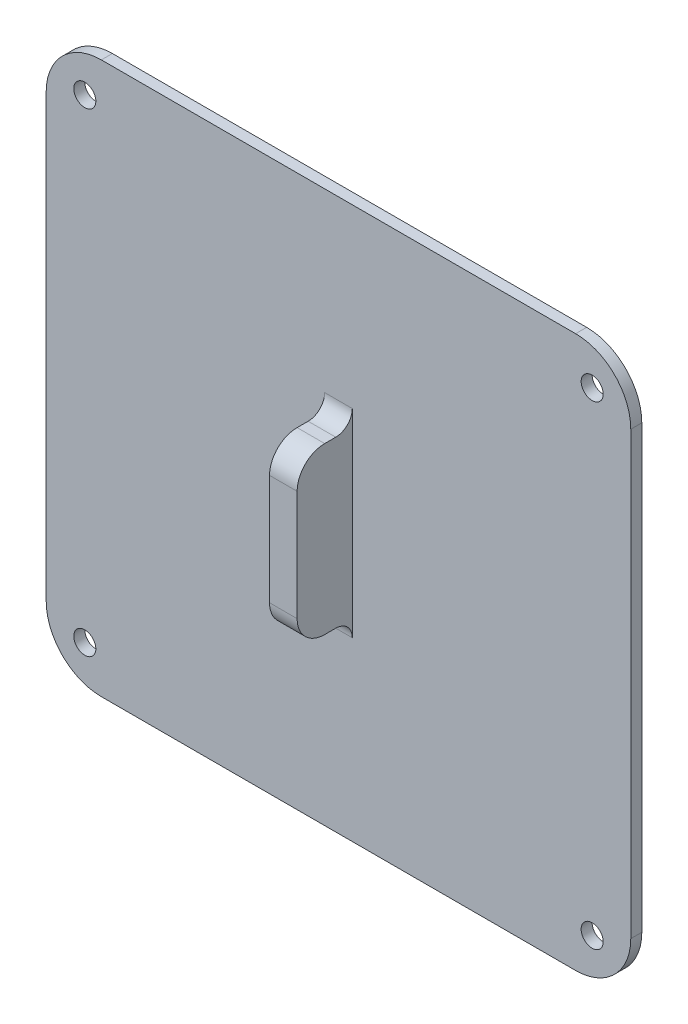
ISO-10303-21;
HEADER;
FILE_DESCRIPTION(('STEP AP214'),'2;1');
FILE_NAME('part.step','',(''),(''),'','','');
FILE_SCHEMA(('AUTOMOTIVE_DESIGN { 1 0 10303 214 1 1 1 1 }'));
ENDSEC;
DATA;
#1=APPLICATION_CONTEXT('core data for automotive mechanical design processes');
#2=APPLICATION_PROTOCOL_DEFINITION('international standard','automotive_design',2000,#1);
#3=PRODUCT_CONTEXT('',#1,'mechanical');
#4=PRODUCT('Part','Part','',(#3));
#5=PRODUCT_RELATED_PRODUCT_CATEGORY('part','',(#4));
#6=PRODUCT_DEFINITION_FORMATION('','',#4);
#7=PRODUCT_DEFINITION_CONTEXT('part definition',#1,'design');
#8=PRODUCT_DEFINITION('design','',#6,#7);
#9=PRODUCT_DEFINITION_SHAPE('','',#8);
#10=(LENGTH_UNIT() NAMED_UNIT(*) SI_UNIT(.MILLI.,.METRE.));
#11=(NAMED_UNIT(*) PLANE_ANGLE_UNIT() SI_UNIT($,.RADIAN.));
#12=(NAMED_UNIT(*) SI_UNIT($,.STERADIAN.) SOLID_ANGLE_UNIT());
#13=UNCERTAINTY_MEASURE_WITH_UNIT(LENGTH_MEASURE(1.E-05),#10,'distance_accuracy_value','');
#14=(GEOMETRIC_REPRESENTATION_CONTEXT(3) GLOBAL_UNCERTAINTY_ASSIGNED_CONTEXT((#13)) GLOBAL_UNIT_ASSIGNED_CONTEXT((#10,
#11,#12)) REPRESENTATION_CONTEXT('',''));
#15=CARTESIAN_POINT('',(0.,0.,0.));
#16=DIRECTION('',(0.,0.,1.));
#17=DIRECTION('',(1.,0.,0.));
#18=AXIS2_PLACEMENT_3D('',#15,#16,#17);
#19=CARTESIAN_POINT('',(-43.0000000000001,270.,0.));
#20=DIRECTION('',(0.,0.,1.));
#21=DIRECTION('',(1.,0.,0.));
#22=AXIS2_PLACEMENT_3D('',#19,#20,#21);
#23=PLANE('',#22);
#24=CARTESIAN_POINT('',(-46.,353.,0.));
#25=DIRECTION('',(0.,0.,1.));
#26=DIRECTION('',(1.,0.,0.));
#27=AXIS2_PLACEMENT_3D('',#24,#25,#26);
#28=CIRCLE('',#27,2.);
#29=CARTESIAN_POINT('',(-44.,353.,0.));
#30=VERTEX_POINT('',#29);
#31=EDGE_CURVE('E196',#30,#30,#28,.T.);
#32=ORIENTED_EDGE('',*,*,#31,.F.);
#33=EDGE_LOOP('',(#32));
#34=FACE_BOUND('',#33,.T.);
#35=CARTESIAN_POINT('',(46.,353.,0.));
#36=DIRECTION('',(0.,0.,1.));
#37=DIRECTION('',(1.,0.,0.));
#38=AXIS2_PLACEMENT_3D('',#35,#36,#37);
#39=CIRCLE('',#38,2.);
#40=CARTESIAN_POINT('',(48.,353.,0.));
#41=VERTEX_POINT('',#40);
#42=EDGE_CURVE('E231',#41,#41,#39,.T.);
#43=ORIENTED_EDGE('',*,*,#42,.F.);
#44=EDGE_LOOP('',(#43));
#45=FACE_BOUND('',#44,.T.);
#46=CARTESIAN_POINT('',(46.,267.,0.));
#47=DIRECTION('',(0.,0.,1.));
#48=DIRECTION('',(1.,0.,0.));
#49=AXIS2_PLACEMENT_3D('',#46,#47,#48);
#50=CIRCLE('',#49,2.);
#51=CARTESIAN_POINT('',(48.,267.,0.));
#52=VERTEX_POINT('',#51);
#53=EDGE_CURVE('E228',#52,#52,#50,.T.);
#54=ORIENTED_EDGE('',*,*,#53,.F.);
#55=EDGE_LOOP('',(#54));
#56=FACE_BOUND('',#55,.T.);
#57=CARTESIAN_POINT('',(-46.,267.,0.));
#58=DIRECTION('',(0.,0.,1.));
#59=DIRECTION('',(1.,0.,0.));
#60=AXIS2_PLACEMENT_3D('',#57,#58,#59);
#61=CIRCLE('',#60,2.);
#62=CARTESIAN_POINT('',(-44.,267.,0.));
#63=VERTEX_POINT('',#62);
#64=EDGE_CURVE('E225',#63,#63,#61,.T.);
#65=ORIENTED_EDGE('',*,*,#64,.F.);
#66=EDGE_LOOP('',(#65));
#67=FACE_BOUND('',#66,.T.);
#68=CARTESIAN_POINT('',(-43.0000000000001,270.,0.));
#69=DIRECTION('',(0.,0.,1.));
#70=DIRECTION('',(1.,0.,0.));
#71=AXIS2_PLACEMENT_3D('',#68,#69,#70);
#72=CIRCLE('',#71,10.);
#73=CARTESIAN_POINT('',(-53.0000000000001,270.,0.));
#74=VERTEX_POINT('',#73);
#75=CARTESIAN_POINT('',(-43.0000000000001,260.,0.));
#76=VERTEX_POINT('',#75);
#77=EDGE_CURVE('E194',#74,#76,#72,.T.);
#78=ORIENTED_EDGE('',*,*,#77,.T.);
#79=DIRECTION('',(1.,0.,0.));
#80=VECTOR('',#79,1.);
#81=CARTESIAN_POINT('',(-43.0000000000001,260.,0.));
#82=LINE('',#81,#80);
#83=CARTESIAN_POINT('',(43.,260.,0.));
#84=VERTEX_POINT('',#83);
#85=EDGE_CURVE('E150',#76,#84,#82,.T.);
#86=ORIENTED_EDGE('',*,*,#85,.T.);
#87=CARTESIAN_POINT('',(43.,270.,0.));
#88=DIRECTION('',(0.,0.,1.));
#89=DIRECTION('',(1.,0.,0.));
#90=AXIS2_PLACEMENT_3D('',#87,#88,#89);
#91=CIRCLE('',#90,10.);
#92=CARTESIAN_POINT('',(53.,270.,0.));
#93=VERTEX_POINT('',#92);
#94=EDGE_CURVE('E198',#84,#93,#91,.T.);
#95=ORIENTED_EDGE('',*,*,#94,.T.);
#96=DIRECTION('',(0.,1.,0.));
#97=VECTOR('',#96,1.);
#98=CARTESIAN_POINT('',(53.,270.,0.));
#99=LINE('',#98,#97);
#100=CARTESIAN_POINT('',(53.,350.,0.));
#101=VERTEX_POINT('',#100);
#102=EDGE_CURVE('E201',#93,#101,#99,.T.);
#103=ORIENTED_EDGE('',*,*,#102,.T.);
#104=CARTESIAN_POINT('',(43.,350.,0.));
#105=DIRECTION('',(0.,0.,1.));
#106=DIRECTION('',(1.,0.,0.));
#107=AXIS2_PLACEMENT_3D('',#104,#105,#106);
#108=CIRCLE('',#107,10.);
#109=CARTESIAN_POINT('',(43.,360.,0.));
#110=VERTEX_POINT('',#109);
#111=EDGE_CURVE('E204',#101,#110,#108,.T.);
#112=ORIENTED_EDGE('',*,*,#111,.T.);
#113=DIRECTION('',(-1.,0.,0.));
#114=VECTOR('',#113,1.);
#115=CARTESIAN_POINT('',(43.,360.,0.));
#116=LINE('',#115,#114);
#117=CARTESIAN_POINT('',(-43.0000000000001,360.,0.));
#118=VERTEX_POINT('',#117);
#119=EDGE_CURVE('E207',#110,#118,#116,.T.);
#120=ORIENTED_EDGE('',*,*,#119,.T.);
#121=CARTESIAN_POINT('',(-43.0000000000001,350.,0.));
#122=DIRECTION('',(0.,0.,1.));
#123=DIRECTION('',(1.,0.,0.));
#124=AXIS2_PLACEMENT_3D('',#121,#122,#123);
#125=CIRCLE('',#124,10.);
#126=CARTESIAN_POINT('',(-53.0000000000001,350.,0.));
#127=VERTEX_POINT('',#126);
#128=EDGE_CURVE('E174',#118,#127,#125,.T.);
#129=ORIENTED_EDGE('',*,*,#128,.T.);
#130=DIRECTION('',(0.,-1.,0.));
#131=VECTOR('',#130,1.);
#132=CARTESIAN_POINT('',(-53.0000000000001,350.,0.));
#133=LINE('',#132,#131);
#134=EDGE_CURVE('E171',#127,#74,#133,.T.);
#135=ORIENTED_EDGE('',*,*,#134,.T.);
#136=EDGE_LOOP('',(#78,#86,#95,#103,#112,#120,#129,#135));
#137=FACE_BOUND('',#136,.T.);
#138=DIRECTION('',(0.,1.,0.));
#139=VECTOR('',#138,1.);
#140=CARTESIAN_POINT('',(2.5,325.,0.));
#141=LINE('',#140,#139);
#142=CARTESIAN_POINT('',(2.5,292.,0.));
#143=VERTEX_POINT('',#142);
#144=CARTESIAN_POINT('',(2.5,328.,0.));
#145=VERTEX_POINT('',#144);
#146=EDGE_CURVE('E276',#143,#145,#141,.T.);
#147=ORIENTED_EDGE('',*,*,#146,.F.);
#148=DIRECTION('',(1.,0.,0.));
#149=VECTOR('',#148,1.);
#150=CARTESIAN_POINT('',(-43.0000000000001,292.,0.));
#151=LINE('',#150,#149);
#152=CARTESIAN_POINT('',(-2.5,292.,0.));
#153=VERTEX_POINT('',#152);
#154=EDGE_CURVE('E259',#143,#153,#151,.F.);
#155=ORIENTED_EDGE('',*,*,#154,.T.);
#156=DIRECTION('',(0.,-1.,0.));
#157=VECTOR('',#156,1.);
#158=CARTESIAN_POINT('',(-2.5,325.,0.));
#159=LINE('',#158,#157);
#160=CARTESIAN_POINT('',(-2.5,328.,0.));
#161=VERTEX_POINT('',#160);
#162=EDGE_CURVE('E272',#161,#153,#159,.T.);
#163=ORIENTED_EDGE('',*,*,#162,.F.);
#164=DIRECTION('',(-1.,0.,0.));
#165=VECTOR('',#164,1.);
#166=CARTESIAN_POINT('',(-43.0000000000001,328.,0.));
#167=LINE('',#166,#165);
#168=EDGE_CURVE('E256',#161,#145,#167,.F.);
#169=ORIENTED_EDGE('',*,*,#168,.T.);
#170=EDGE_LOOP('',(#147,#155,#163,#169));
#171=FACE_BOUND('',#170,.T.);
#172=ADVANCED_FACE('F32',(#34,#45,#56,#67,#137,#171),#23,.T.);
#173=CARTESIAN_POINT('',(-43.0000000000001,270.,-2.));
#174=DIRECTION('',(0.,0.,1.));
#175=DIRECTION('',(1.,0.,0.));
#176=AXIS2_PLACEMENT_3D('',#173,#174,#175);
#177=CYLINDRICAL_SURFACE('',#176,10.);
#178=ORIENTED_EDGE('',*,*,#77,.F.);
#179=DIRECTION('',(0.,0.,1.));
#180=VECTOR('',#179,1.);
#181=CARTESIAN_POINT('',(-53.0000000000001,270.,-2.));
#182=LINE('',#181,#180);
#183=CARTESIAN_POINT('',(-53.0000000000001,270.,-2.));
#184=VERTEX_POINT('',#183);
#185=EDGE_CURVE('E170',#184,#74,#182,.T.);
#186=ORIENTED_EDGE('',*,*,#185,.F.);
#187=CARTESIAN_POINT('',(-43.0000000000001,270.,-2.));
#188=DIRECTION('',(0.,0.,1.));
#189=DIRECTION('',(1.,0.,0.));
#190=AXIS2_PLACEMENT_3D('',#187,#188,#189);
#191=CIRCLE('',#190,10.);
#192=CARTESIAN_POINT('',(-43.0000000000001,260.,-2.));
#193=VERTEX_POINT('',#192);
#194=EDGE_CURVE('E163',#184,#193,#191,.T.);
#195=ORIENTED_EDGE('',*,*,#194,.T.);
#196=DIRECTION('',(0.,0.,1.));
#197=VECTOR('',#196,1.);
#198=CARTESIAN_POINT('',(-43.0000000000001,260.,-2.));
#199=LINE('',#198,#197);
#200=EDGE_CURVE('E145',#193,#76,#199,.T.);
#201=ORIENTED_EDGE('',*,*,#200,.T.);
#202=EDGE_LOOP('',(#178,#186,#195,#201));
#203=FACE_BOUND('',#202,.T.);
#204=ADVANCED_FACE('F169',(#203),#177,.T.);
#205=CARTESIAN_POINT('',(-53.0000000000001,350.,-2.));
#206=DIRECTION('',(-1.,0.,0.));
#207=DIRECTION('',(0.,-1.,0.));
#208=AXIS2_PLACEMENT_3D('',#205,#206,#207);
#209=PLANE('',#208);
#210=ORIENTED_EDGE('',*,*,#134,.F.);
#211=DIRECTION('',(0.,0.,1.));
#212=VECTOR('',#211,1.);
#213=CARTESIAN_POINT('',(-53.0000000000001,350.,-2.));
#214=LINE('',#213,#212);
#215=CARTESIAN_POINT('',(-53.0000000000001,350.,-2.));
#216=VERTEX_POINT('',#215);
#217=EDGE_CURVE('E214',#216,#127,#214,.T.);
#218=ORIENTED_EDGE('',*,*,#217,.F.);
#219=DIRECTION('',(0.,-1.,0.));
#220=VECTOR('',#219,1.);
#221=CARTESIAN_POINT('',(-53.0000000000001,350.,-2.));
#222=LINE('',#221,#220);
#223=EDGE_CURVE('E156',#216,#184,#222,.T.);
#224=ORIENTED_EDGE('',*,*,#223,.T.);
#225=ORIENTED_EDGE('',*,*,#185,.T.);
#226=EDGE_LOOP('',(#210,#218,#224,#225));
#227=FACE_BOUND('',#226,.T.);
#228=ADVANCED_FACE('F334',(#227),#209,.T.);
#229=CARTESIAN_POINT('',(-43.0000000000001,350.,-2.));
#230=DIRECTION('',(0.,0.,1.));
#231=DIRECTION('',(1.,0.,0.));
#232=AXIS2_PLACEMENT_3D('',#229,#230,#231);
#233=CYLINDRICAL_SURFACE('',#232,10.);
#234=ORIENTED_EDGE('',*,*,#128,.F.);
#235=DIRECTION('',(0.,0.,1.));
#236=VECTOR('',#235,1.);
#237=CARTESIAN_POINT('',(-43.0000000000001,360.,-2.));
#238=LINE('',#237,#236);
#239=CARTESIAN_POINT('',(-43.0000000000001,360.,-2.));
#240=VERTEX_POINT('',#239);
#241=EDGE_CURVE('E216',#240,#118,#238,.T.);
#242=ORIENTED_EDGE('',*,*,#241,.F.);
#243=CARTESIAN_POINT('',(-43.0000000000001,350.,-2.));
#244=DIRECTION('',(0.,0.,1.));
#245=DIRECTION('',(1.,0.,0.));
#246=AXIS2_PLACEMENT_3D('',#243,#244,#245);
#247=CIRCLE('',#246,10.);
#248=EDGE_CURVE('E190',#240,#216,#247,.T.);
#249=ORIENTED_EDGE('',*,*,#248,.T.);
#250=ORIENTED_EDGE('',*,*,#217,.T.);
#251=EDGE_LOOP('',(#234,#242,#249,#250));
#252=FACE_BOUND('',#251,.T.);
#253=ADVANCED_FACE('F341',(#252),#233,.T.);
#254=CARTESIAN_POINT('',(43.,360.,-2.));
#255=DIRECTION('',(0.,1.,0.));
#256=DIRECTION('',(0.,0.,1.));
#257=AXIS2_PLACEMENT_3D('',#254,#255,#256);
#258=PLANE('',#257);
#259=ORIENTED_EDGE('',*,*,#119,.F.);
#260=DIRECTION('',(0.,0.,1.));
#261=VECTOR('',#260,1.);
#262=CARTESIAN_POINT('',(43.,360.,-2.));
#263=LINE('',#262,#261);
#264=CARTESIAN_POINT('',(43.,360.,-2.));
#265=VERTEX_POINT('',#264);
#266=EDGE_CURVE('E218',#265,#110,#263,.T.);
#267=ORIENTED_EDGE('',*,*,#266,.F.);
#268=DIRECTION('',(-1.,0.,0.));
#269=VECTOR('',#268,1.);
#270=CARTESIAN_POINT('',(43.,360.,-2.));
#271=LINE('',#270,#269);
#272=EDGE_CURVE('E187',#265,#240,#271,.T.);
#273=ORIENTED_EDGE('',*,*,#272,.T.);
#274=ORIENTED_EDGE('',*,*,#241,.T.);
#275=EDGE_LOOP('',(#259,#267,#273,#274));
#276=FACE_BOUND('',#275,.T.);
#277=ADVANCED_FACE('F345',(#276),#258,.T.);
#278=CARTESIAN_POINT('',(43.,350.,-2.));
#279=DIRECTION('',(0.,0.,1.));
#280=DIRECTION('',(1.,0.,0.));
#281=AXIS2_PLACEMENT_3D('',#278,#279,#280);
#282=CYLINDRICAL_SURFACE('',#281,10.);
#283=ORIENTED_EDGE('',*,*,#111,.F.);
#284=DIRECTION('',(0.,0.,1.));
#285=VECTOR('',#284,1.);
#286=CARTESIAN_POINT('',(53.,350.,-2.));
#287=LINE('',#286,#285);
#288=CARTESIAN_POINT('',(53.,350.,-2.));
#289=VERTEX_POINT('',#288);
#290=EDGE_CURVE('E220',#289,#101,#287,.T.);
#291=ORIENTED_EDGE('',*,*,#290,.F.);
#292=CARTESIAN_POINT('',(43.,350.,-2.));
#293=DIRECTION('',(0.,0.,1.));
#294=DIRECTION('',(1.,0.,0.));
#295=AXIS2_PLACEMENT_3D('',#292,#293,#294);
#296=CIRCLE('',#295,10.);
#297=EDGE_CURVE('E184',#289,#265,#296,.T.);
#298=ORIENTED_EDGE('',*,*,#297,.T.);
#299=ORIENTED_EDGE('',*,*,#266,.T.);
#300=EDGE_LOOP('',(#283,#291,#298,#299));
#301=FACE_BOUND('',#300,.T.);
#302=ADVANCED_FACE('F349',(#301),#282,.T.);
#303=CARTESIAN_POINT('',(53.,270.,-2.));
#304=DIRECTION('',(1.,0.,0.));
#305=DIRECTION('',(0.,1.,0.));
#306=AXIS2_PLACEMENT_3D('',#303,#304,#305);
#307=PLANE('',#306);
#308=ORIENTED_EDGE('',*,*,#102,.F.);
#309=DIRECTION('',(0.,0.,1.));
#310=VECTOR('',#309,1.);
#311=CARTESIAN_POINT('',(53.,270.,-2.));
#312=LINE('',#311,#310);
#313=CARTESIAN_POINT('',(53.,270.,-2.));
#314=VERTEX_POINT('',#313);
#315=EDGE_CURVE('E222',#314,#93,#312,.T.);
#316=ORIENTED_EDGE('',*,*,#315,.F.);
#317=DIRECTION('',(0.,1.,0.));
#318=VECTOR('',#317,1.);
#319=CARTESIAN_POINT('',(53.,270.,-2.));
#320=LINE('',#319,#318);
#321=EDGE_CURVE('E181',#314,#289,#320,.T.);
#322=ORIENTED_EDGE('',*,*,#321,.T.);
#323=ORIENTED_EDGE('',*,*,#290,.T.);
#324=EDGE_LOOP('',(#308,#316,#322,#323));
#325=FACE_BOUND('',#324,.T.);
#326=ADVANCED_FACE('F353',(#325),#307,.T.);
#327=CARTESIAN_POINT('',(43.,270.,-2.));
#328=DIRECTION('',(0.,0.,1.));
#329=DIRECTION('',(1.,0.,0.));
#330=AXIS2_PLACEMENT_3D('',#327,#328,#329);
#331=CYLINDRICAL_SURFACE('',#330,10.);
#332=ORIENTED_EDGE('',*,*,#94,.F.);
#333=DIRECTION('',(0.,0.,1.));
#334=VECTOR('',#333,1.);
#335=CARTESIAN_POINT('',(43.,260.,-2.));
#336=LINE('',#335,#334);
#337=CARTESIAN_POINT('',(43.,260.,-2.));
#338=VERTEX_POINT('',#337);
#339=EDGE_CURVE('E155',#338,#84,#336,.T.);
#340=ORIENTED_EDGE('',*,*,#339,.F.);
#341=CARTESIAN_POINT('',(43.,270.,-2.));
#342=DIRECTION('',(0.,0.,1.));
#343=DIRECTION('',(1.,0.,0.));
#344=AXIS2_PLACEMENT_3D('',#341,#342,#343);
#345=CIRCLE('',#344,10.);
#346=EDGE_CURVE('E167',#338,#314,#345,.T.);
#347=ORIENTED_EDGE('',*,*,#346,.T.);
#348=ORIENTED_EDGE('',*,*,#315,.T.);
#349=EDGE_LOOP('',(#332,#340,#347,#348));
#350=FACE_BOUND('',#349,.T.);
#351=ADVANCED_FACE('F357',(#350),#331,.T.);
#352=CARTESIAN_POINT('',(-43.0000000000001,260.,-2.));
#353=DIRECTION('',(0.,-1.,0.));
#354=DIRECTION('',(0.,0.,-1.));
#355=AXIS2_PLACEMENT_3D('',#352,#353,#354);
#356=PLANE('',#355);
#357=ORIENTED_EDGE('',*,*,#85,.F.);
#358=ORIENTED_EDGE('',*,*,#200,.F.);
#359=DIRECTION('',(1.,0.,0.));
#360=VECTOR('',#359,1.);
#361=CARTESIAN_POINT('',(-43.0000000000001,260.,-2.));
#362=LINE('',#361,#360);
#363=EDGE_CURVE('E148',#193,#338,#362,.T.);
#364=ORIENTED_EDGE('',*,*,#363,.T.);
#365=ORIENTED_EDGE('',*,*,#339,.T.);
#366=EDGE_LOOP('',(#357,#358,#364,#365));
#367=FACE_BOUND('',#366,.T.);
#368=ADVANCED_FACE('F147',(#367),#356,.T.);
#369=CARTESIAN_POINT('',(-43.0000000000001,270.,-2.));
#370=DIRECTION('',(0.,0.,1.));
#371=DIRECTION('',(1.,0.,0.));
#372=AXIS2_PLACEMENT_3D('',#369,#370,#371);
#373=PLANE('',#372);
#374=CARTESIAN_POINT('',(-46.,353.,-2.));
#375=DIRECTION('',(0.,0.,-1.));
#376=DIRECTION('',(1.,0.,0.));
#377=AXIS2_PLACEMENT_3D('',#374,#375,#376);
#378=CIRCLE('',#377,2.);
#379=CARTESIAN_POINT('',(-44.,353.,-2.));
#380=VERTEX_POINT('',#379);
#381=EDGE_CURVE('E295',#380,#380,#378,.T.);
#382=ORIENTED_EDGE('',*,*,#381,.F.);
#383=EDGE_LOOP('',(#382));
#384=FACE_BOUND('',#383,.T.);
#385=CARTESIAN_POINT('',(46.,353.,-2.));
#386=DIRECTION('',(0.,0.,-1.));
#387=DIRECTION('',(1.,0.,0.));
#388=AXIS2_PLACEMENT_3D('',#385,#386,#387);
#389=CIRCLE('',#388,2.);
#390=CARTESIAN_POINT('',(48.,353.,-2.));
#391=VERTEX_POINT('',#390);
#392=EDGE_CURVE('E299',#391,#391,#389,.T.);
#393=ORIENTED_EDGE('',*,*,#392,.F.);
#394=EDGE_LOOP('',(#393));
#395=FACE_BOUND('',#394,.T.);
#396=CARTESIAN_POINT('',(46.,267.,-2.));
#397=DIRECTION('',(0.,0.,-1.));
#398=DIRECTION('',(-1.,0.,0.));
#399=AXIS2_PLACEMENT_3D('',#396,#397,#398);
#400=CIRCLE('',#399,2.);
#401=CARTESIAN_POINT('',(44.,267.,-2.));
#402=VERTEX_POINT('',#401);
#403=EDGE_CURVE('E296',#402,#402,#400,.T.);
#404=ORIENTED_EDGE('',*,*,#403,.F.);
#405=EDGE_LOOP('',(#404));
#406=FACE_BOUND('',#405,.T.);
#407=CARTESIAN_POINT('',(-46.,267.,-2.));
#408=DIRECTION('',(0.,0.,-1.));
#409=DIRECTION('',(-1.,0.,0.));
#410=AXIS2_PLACEMENT_3D('',#407,#408,#409);
#411=CIRCLE('',#410,2.);
#412=CARTESIAN_POINT('',(-48.,267.,-2.));
#413=VERTEX_POINT('',#412);
#414=EDGE_CURVE('E177',#413,#413,#411,.T.);
#415=ORIENTED_EDGE('',*,*,#414,.F.);
#416=EDGE_LOOP('',(#415));
#417=FACE_BOUND('',#416,.T.);
#418=ORIENTED_EDGE('',*,*,#194,.F.);
#419=ORIENTED_EDGE('',*,*,#223,.F.);
#420=ORIENTED_EDGE('',*,*,#248,.F.);
#421=ORIENTED_EDGE('',*,*,#272,.F.);
#422=ORIENTED_EDGE('',*,*,#297,.F.);
#423=ORIENTED_EDGE('',*,*,#321,.F.);
#424=ORIENTED_EDGE('',*,*,#346,.F.);
#425=ORIENTED_EDGE('',*,*,#363,.F.);
#426=EDGE_LOOP('',(#418,#419,#420,#421,#422,#423,#424,#425));
#427=FACE_BOUND('',#426,.T.);
#428=ADVANCED_FACE('F161',(#384,#395,#406,#417,#427),#373,.F.);
#429=CARTESIAN_POINT('',(-46.,267.,1.));
#430=DIRECTION('',(0.,0.,-1.));
#431=DIRECTION('',(-1.,0.,0.));
#432=AXIS2_PLACEMENT_3D('',#429,#430,#431);
#433=CYLINDRICAL_SURFACE('',#432,2.);
#434=ORIENTED_EDGE('',*,*,#64,.T.);
#435=EDGE_LOOP('',(#434));
#436=FACE_BOUND('',#435,.T.);
#437=ORIENTED_EDGE('',*,*,#414,.T.);
#438=EDGE_LOOP('',(#437));
#439=FACE_BOUND('',#438,.T.);
#440=ADVANCED_FACE('F308',(#436,#439),#433,.F.);
#441=CARTESIAN_POINT('',(46.,267.,1.));
#442=DIRECTION('',(0.,0.,-1.));
#443=DIRECTION('',(-1.,0.,0.));
#444=AXIS2_PLACEMENT_3D('',#441,#442,#443);
#445=CYLINDRICAL_SURFACE('',#444,2.);
#446=ORIENTED_EDGE('',*,*,#53,.T.);
#447=EDGE_LOOP('',(#446));
#448=FACE_BOUND('',#447,.T.);
#449=ORIENTED_EDGE('',*,*,#403,.T.);
#450=EDGE_LOOP('',(#449));
#451=FACE_BOUND('',#450,.T.);
#452=ADVANCED_FACE('F318',(#448,#451),#445,.F.);
#453=CARTESIAN_POINT('',(46.,353.,1.));
#454=DIRECTION('',(0.,0.,-1.));
#455=DIRECTION('',(-1.,0.,0.));
#456=AXIS2_PLACEMENT_3D('',#453,#454,#455);
#457=CYLINDRICAL_SURFACE('',#456,2.);
#458=ORIENTED_EDGE('',*,*,#42,.T.);
#459=EDGE_LOOP('',(#458));
#460=FACE_BOUND('',#459,.T.);
#461=ORIENTED_EDGE('',*,*,#392,.T.);
#462=EDGE_LOOP('',(#461));
#463=FACE_BOUND('',#462,.T.);
#464=ADVANCED_FACE('F324',(#460,#463),#457,.F.);
#465=CARTESIAN_POINT('',(-46.,353.,1.));
#466=DIRECTION('',(0.,0.,-1.));
#467=DIRECTION('',(-1.,0.,0.));
#468=AXIS2_PLACEMENT_3D('',#465,#466,#467);
#469=CYLINDRICAL_SURFACE('',#468,2.);
#470=ORIENTED_EDGE('',*,*,#31,.T.);
#471=EDGE_LOOP('',(#470));
#472=FACE_BOUND('',#471,.T.);
#473=ORIENTED_EDGE('',*,*,#381,.T.);
#474=EDGE_LOOP('',(#473));
#475=FACE_BOUND('',#474,.T.);
#476=ADVANCED_FACE('F304',(#472,#475),#469,.F.);
#477=CARTESIAN_POINT('',(-2.5,325.,10.));
#478=DIRECTION('',(1.,0.,0.));
#479=DIRECTION('',(0.,1.,0.));
#480=AXIS2_PLACEMENT_3D('',#477,#478,#479);
#481=PLANE('',#480);
#482=DIRECTION('',(0.,-1.,0.));
#483=VECTOR('',#482,1.);
#484=CARTESIAN_POINT('',(-2.5,325.,10.));
#485=LINE('',#484,#483);
#486=CARTESIAN_POINT('',(-2.5,320.,10.));
#487=VERTEX_POINT('',#486);
#488=CARTESIAN_POINT('',(-2.5,300.,10.));
#489=VERTEX_POINT('',#488);
#490=EDGE_CURVE('E280',#487,#489,#485,.T.);
#491=ORIENTED_EDGE('',*,*,#490,.F.);
#492=CARTESIAN_POINT('',(-2.5,320.,5.));
#493=DIRECTION('',(1.,0.,0.));
#494=DIRECTION('',(0.,1.,0.));
#495=AXIS2_PLACEMENT_3D('',#492,#493,#494);
#496=CIRCLE('',#495,5.);
#497=CARTESIAN_POINT('',(-2.5,325.,5.));
#498=VERTEX_POINT('',#497);
#499=EDGE_CURVE('E243',#487,#498,#496,.F.);
#500=ORIENTED_EDGE('',*,*,#499,.T.);
#501=DIRECTION('',(0.,0.,-1.));
#502=VECTOR('',#501,1.);
#503=CARTESIAN_POINT('',(-2.5,325.,10.));
#504=LINE('',#503,#502);
#505=CARTESIAN_POINT('',(-2.5,325.,3.));
#506=VERTEX_POINT('',#505);
#507=EDGE_CURVE('E274',#498,#506,#504,.T.);
#508=ORIENTED_EDGE('',*,*,#507,.T.);
#509=CARTESIAN_POINT('',(-2.5,328.,3.));
#510=DIRECTION('',(1.,0.,0.));
#511=DIRECTION('',(0.,1.,0.));
#512=AXIS2_PLACEMENT_3D('',#509,#510,#511);
#513=CIRCLE('',#512,3.);
#514=EDGE_CURVE('E40',#506,#161,#513,.T.);
#515=ORIENTED_EDGE('',*,*,#514,.T.);
#516=ORIENTED_EDGE('',*,*,#162,.T.);
#517=CARTESIAN_POINT('',(-2.5,292.,3.));
#518=DIRECTION('',(1.,0.,0.));
#519=DIRECTION('',(0.,1.,0.));
#520=AXIS2_PLACEMENT_3D('',#517,#518,#519);
#521=CIRCLE('',#520,3.);
#522=CARTESIAN_POINT('',(-2.5,295.,3.));
#523=VERTEX_POINT('',#522);
#524=EDGE_CURVE('E267',#153,#523,#521,.T.);
#525=ORIENTED_EDGE('',*,*,#524,.T.);
#526=DIRECTION('',(0.,0.,-1.));
#527=VECTOR('',#526,1.);
#528=CARTESIAN_POINT('',(-2.5,295.,10.));
#529=LINE('',#528,#527);
#530=CARTESIAN_POINT('',(-2.5,295.,5.));
#531=VERTEX_POINT('',#530);
#532=EDGE_CURVE('E292',#531,#523,#529,.T.);
#533=ORIENTED_EDGE('',*,*,#532,.F.);
#534=CARTESIAN_POINT('',(-2.5,300.,5.));
#535=DIRECTION('',(1.,0.,0.));
#536=DIRECTION('',(0.,1.,0.));
#537=AXIS2_PLACEMENT_3D('',#534,#535,#536);
#538=CIRCLE('',#537,5.);
#539=EDGE_CURVE('E241',#531,#489,#538,.F.);
#540=ORIENTED_EDGE('',*,*,#539,.T.);
#541=EDGE_LOOP('',(#491,#500,#508,#515,#516,#525,#533,#540));
#542=FACE_BOUND('',#541,.T.);
#543=ADVANCED_FACE('F271',(#542),#481,.F.);
#544=CARTESIAN_POINT('',(-2.5,295.,10.));
#545=DIRECTION('',(0.,1.,0.));
#546=DIRECTION('',(0.,0.,1.));
#547=AXIS2_PLACEMENT_3D('',#544,#545,#546);
#548=PLANE('',#547);
#549=ORIENTED_EDGE('',*,*,#532,.T.);
#550=DIRECTION('',(1.,0.,0.));
#551=VECTOR('',#550,1.);
#552=CARTESIAN_POINT('',(-2.5,295.,3.));
#553=LINE('',#552,#551);
#554=CARTESIAN_POINT('',(2.5,295.,3.));
#555=VERTEX_POINT('',#554);
#556=EDGE_CURVE('E253',#523,#555,#553,.T.);
#557=ORIENTED_EDGE('',*,*,#556,.T.);
#558=DIRECTION('',(0.,0.,-1.));
#559=VECTOR('',#558,1.);
#560=CARTESIAN_POINT('',(2.5,295.,10.));
#561=LINE('',#560,#559);
#562=CARTESIAN_POINT('',(2.5,295.,5.));
#563=VERTEX_POINT('',#562);
#564=EDGE_CURVE('E289',#563,#555,#561,.T.);
#565=ORIENTED_EDGE('',*,*,#564,.F.);
#566=DIRECTION('',(1.,0.,0.));
#567=VECTOR('',#566,1.);
#568=CARTESIAN_POINT('',(-2.5,295.,5.));
#569=LINE('',#568,#567);
#570=EDGE_CURVE('E251',#563,#531,#569,.F.);
#571=ORIENTED_EDGE('',*,*,#570,.T.);
#572=EDGE_LOOP('',(#549,#557,#565,#571));
#573=FACE_BOUND('',#572,.T.);
#574=ADVANCED_FACE('F382',(#573),#548,.F.);
#575=CARTESIAN_POINT('',(2.5,325.,10.));
#576=DIRECTION('',(-1.,0.,0.));
#577=DIRECTION('',(0.,-1.,0.));
#578=AXIS2_PLACEMENT_3D('',#575,#576,#577);
#579=PLANE('',#578);
#580=DIRECTION('',(0.,0.,-1.));
#581=VECTOR('',#580,1.);
#582=CARTESIAN_POINT('',(2.5,325.,10.));
#583=LINE('',#582,#581);
#584=CARTESIAN_POINT('',(2.5,325.,5.));
#585=VERTEX_POINT('',#584);
#586=CARTESIAN_POINT('',(2.5,325.,3.));
#587=VERTEX_POINT('',#586);
#588=EDGE_CURVE('E287',#585,#587,#583,.T.);
#589=ORIENTED_EDGE('',*,*,#588,.F.);
#590=CARTESIAN_POINT('',(2.5,320.,5.));
#591=DIRECTION('',(-1.,0.,0.));
#592=DIRECTION('',(0.,-1.,0.));
#593=AXIS2_PLACEMENT_3D('',#590,#591,#592);
#594=CIRCLE('',#593,5.);
#595=CARTESIAN_POINT('',(2.5,320.,10.));
#596=VERTEX_POINT('',#595);
#597=EDGE_CURVE('E249',#585,#596,#594,.F.);
#598=ORIENTED_EDGE('',*,*,#597,.T.);
#599=DIRECTION('',(0.,1.,0.));
#600=VECTOR('',#599,1.);
#601=CARTESIAN_POINT('',(2.5,325.,10.));
#602=LINE('',#601,#600);
#603=CARTESIAN_POINT('',(2.5,300.,10.));
#604=VERTEX_POINT('',#603);
#605=EDGE_CURVE('E283',#604,#596,#602,.T.);
#606=ORIENTED_EDGE('',*,*,#605,.F.);
#607=CARTESIAN_POINT('',(2.5,300.,5.));
#608=DIRECTION('',(-1.,0.,0.));
#609=DIRECTION('',(0.,-1.,0.));
#610=AXIS2_PLACEMENT_3D('',#607,#608,#609);
#611=CIRCLE('',#610,5.);
#612=EDGE_CURVE('E247',#604,#563,#611,.F.);
#613=ORIENTED_EDGE('',*,*,#612,.T.);
#614=ORIENTED_EDGE('',*,*,#564,.T.);
#615=CARTESIAN_POINT('',(2.5,292.,3.));
#616=DIRECTION('',(-1.,0.,0.));
#617=DIRECTION('',(0.,-1.,0.));
#618=AXIS2_PLACEMENT_3D('',#615,#616,#617);
#619=CIRCLE('',#618,3.);
#620=EDGE_CURVE('E264',#555,#143,#619,.T.);
#621=ORIENTED_EDGE('',*,*,#620,.T.);
#622=ORIENTED_EDGE('',*,*,#146,.T.);
#623=CARTESIAN_POINT('',(2.5,328.,3.));
#624=DIRECTION('',(-1.,0.,0.));
#625=DIRECTION('',(0.,-1.,0.));
#626=AXIS2_PLACEMENT_3D('',#623,#624,#625);
#627=CIRCLE('',#626,3.);
#628=EDGE_CURVE('E11',#145,#587,#627,.T.);
#629=ORIENTED_EDGE('',*,*,#628,.T.);
#630=EDGE_LOOP('',(#589,#598,#606,#613,#614,#621,#622,#629));
#631=FACE_BOUND('',#630,.T.);
#632=ADVANCED_FACE('F395',(#631),#579,.F.);
#633=CARTESIAN_POINT('',(-2.5,325.,10.));
#634=DIRECTION('',(0.,-1.,0.));
#635=DIRECTION('',(0.,0.,-1.));
#636=AXIS2_PLACEMENT_3D('',#633,#634,#635);
#637=PLANE('',#636);
#638=ORIENTED_EDGE('',*,*,#588,.T.);
#639=DIRECTION('',(-1.,0.,0.));
#640=VECTOR('',#639,1.);
#641=CARTESIAN_POINT('',(-2.5,325.,3.));
#642=LINE('',#641,#640);
#643=EDGE_CURVE('E262',#587,#506,#642,.T.);
#644=ORIENTED_EDGE('',*,*,#643,.T.);
#645=ORIENTED_EDGE('',*,*,#507,.F.);
#646=DIRECTION('',(-1.,0.,0.));
#647=VECTOR('',#646,1.);
#648=CARTESIAN_POINT('',(2.5,325.,5.));
#649=LINE('',#648,#647);
#650=EDGE_CURVE('E245',#498,#585,#649,.F.);
#651=ORIENTED_EDGE('',*,*,#650,.T.);
#652=EDGE_LOOP('',(#638,#644,#645,#651));
#653=FACE_BOUND('',#652,.T.);
#654=ADVANCED_FACE('F394',(#653),#637,.F.);
#655=CARTESIAN_POINT('',(0.,0.,10.));
#656=DIRECTION('',(0.,0.,1.));
#657=DIRECTION('',(1.,0.,0.));
#658=AXIS2_PLACEMENT_3D('',#655,#656,#657);
#659=PLANE('',#658);
#660=ORIENTED_EDGE('',*,*,#605,.T.);
#661=DIRECTION('',(-1.,0.,0.));
#662=VECTOR('',#661,1.);
#663=CARTESIAN_POINT('',(-2.5,320.,10.));
#664=LINE('',#663,#662);
#665=EDGE_CURVE('E238',#596,#487,#664,.T.);
#666=ORIENTED_EDGE('',*,*,#665,.T.);
#667=ORIENTED_EDGE('',*,*,#490,.T.);
#668=DIRECTION('',(1.,0.,0.));
#669=VECTOR('',#668,1.);
#670=CARTESIAN_POINT('',(2.5,300.,10.));
#671=LINE('',#670,#669);
#672=EDGE_CURVE('E213',#489,#604,#671,.T.);
#673=ORIENTED_EDGE('',*,*,#672,.T.);
#674=EDGE_LOOP('',(#660,#666,#667,#673));
#675=FACE_BOUND('',#674,.T.);
#676=ADVANCED_FACE('F368',(#675),#659,.T.);
#677=CARTESIAN_POINT('',(0.,320.,5.));
#678=DIRECTION('',(1.,0.,0.));
#679=DIRECTION('',(0.,0.,-1.));
#680=AXIS2_PLACEMENT_3D('',#677,#678,#679);
#681=CYLINDRICAL_SURFACE('',#680,5.);
#682=ORIENTED_EDGE('',*,*,#597,.F.);
#683=ORIENTED_EDGE('',*,*,#650,.F.);
#684=ORIENTED_EDGE('',*,*,#499,.F.);
#685=ORIENTED_EDGE('',*,*,#665,.F.);
#686=EDGE_LOOP('',(#682,#683,#684,#685));
#687=FACE_BOUND('',#686,.T.);
#688=ADVANCED_FACE('F364',(#687),#681,.T.);
#689=CARTESIAN_POINT('',(0.,300.,5.));
#690=DIRECTION('',(-1.,0.,0.));
#691=DIRECTION('',(0.,0.,1.));
#692=AXIS2_PLACEMENT_3D('',#689,#690,#691);
#693=CYLINDRICAL_SURFACE('',#692,5.);
#694=ORIENTED_EDGE('',*,*,#539,.F.);
#695=ORIENTED_EDGE('',*,*,#570,.F.);
#696=ORIENTED_EDGE('',*,*,#612,.F.);
#697=ORIENTED_EDGE('',*,*,#672,.F.);
#698=EDGE_LOOP('',(#694,#695,#696,#697));
#699=FACE_BOUND('',#698,.T.);
#700=ADVANCED_FACE('F367',(#699),#693,.T.);
#701=CARTESIAN_POINT('',(-2.5,292.,3.));
#702=DIRECTION('',(1.,0.,0.));
#703=DIRECTION('',(0.,0.,-1.));
#704=AXIS2_PLACEMENT_3D('',#701,#702,#703);
#705=CYLINDRICAL_SURFACE('',#704,3.);
#706=ORIENTED_EDGE('',*,*,#524,.F.);
#707=ORIENTED_EDGE('',*,*,#154,.F.);
#708=ORIENTED_EDGE('',*,*,#620,.F.);
#709=ORIENTED_EDGE('',*,*,#556,.F.);
#710=EDGE_LOOP('',(#706,#707,#708,#709));
#711=FACE_BOUND('',#710,.T.);
#712=ADVANCED_FACE('F371',(#711),#705,.F.);
#713=CARTESIAN_POINT('',(-2.5,328.,3.));
#714=DIRECTION('',(-1.,0.,0.));
#715=DIRECTION('',(0.,0.,1.));
#716=AXIS2_PLACEMENT_3D('',#713,#714,#715);
#717=CYLINDRICAL_SURFACE('',#716,3.);
#718=ORIENTED_EDGE('',*,*,#628,.F.);
#719=ORIENTED_EDGE('',*,*,#168,.F.);
#720=ORIENTED_EDGE('',*,*,#514,.F.);
#721=ORIENTED_EDGE('',*,*,#643,.F.);
#722=EDGE_LOOP('',(#718,#719,#720,#721));
#723=FACE_BOUND('',#722,.T.);
#724=ADVANCED_FACE('F34',(#723),#717,.F.);
#725=CLOSED_SHELL('',(#172,#204,#228,#253,#277,#302,#326,#351,#368,#428,#440,#452,#464,#476,
#543,#574,#632,#654,#676,#688,#700,#712,#724));
#726=MANIFOLD_SOLID_BREP('B2',#725);
#727=ADVANCED_BREP_SHAPE_REPRESENTATION('',(#18,#726),#14);
#728=SHAPE_DEFINITION_REPRESENTATION(#9,#727);
ENDSEC;
END-ISO-10303-21;
